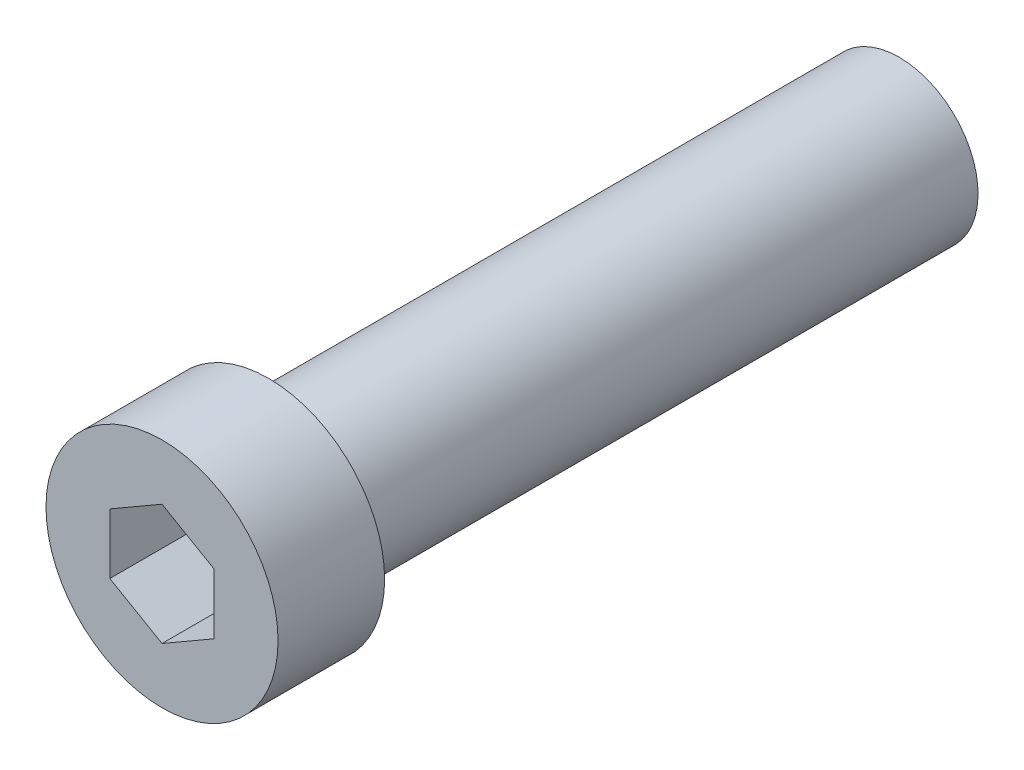
ISO-10303-21;
HEADER;
FILE_DESCRIPTION(('STEP AP214'),'2;1');
FILE_NAME('part.step','',(''),(''),'','','');
FILE_SCHEMA(('AUTOMOTIVE_DESIGN { 1 0 10303 214 1 1 1 1 }'));
ENDSEC;
DATA;
#1=APPLICATION_CONTEXT('core data for automotive mechanical design processes');
#2=APPLICATION_PROTOCOL_DEFINITION('international standard','automotive_design',2000,#1);
#3=PRODUCT_CONTEXT('',#1,'mechanical');
#4=PRODUCT('Part','Part','',(#3));
#5=PRODUCT_RELATED_PRODUCT_CATEGORY('part','',(#4));
#6=PRODUCT_DEFINITION_FORMATION('','',#4);
#7=PRODUCT_DEFINITION_CONTEXT('part definition',#1,'design');
#8=PRODUCT_DEFINITION('design','',#6,#7);
#9=PRODUCT_DEFINITION_SHAPE('','',#8);
#10=(LENGTH_UNIT() NAMED_UNIT(*) SI_UNIT(.MILLI.,.METRE.));
#11=(NAMED_UNIT(*) PLANE_ANGLE_UNIT() SI_UNIT($,.RADIAN.));
#12=(NAMED_UNIT(*) SI_UNIT($,.STERADIAN.) SOLID_ANGLE_UNIT());
#13=UNCERTAINTY_MEASURE_WITH_UNIT(LENGTH_MEASURE(1.E-05),#10,'distance_accuracy_value','');
#14=(GEOMETRIC_REPRESENTATION_CONTEXT(3) GLOBAL_UNCERTAINTY_ASSIGNED_CONTEXT((#13)) GLOBAL_UNIT_ASSIGNED_CONTEXT((#10,
#11,#12)) REPRESENTATION_CONTEXT('',''));
#15=CARTESIAN_POINT('',(0.,0.,0.));
#16=DIRECTION('',(0.,0.,1.));
#17=DIRECTION('',(1.,0.,0.));
#18=AXIS2_PLACEMENT_3D('',#15,#16,#17);
#19=CARTESIAN_POINT('',(0.,0.,2.028));
#20=DIRECTION('',(0.,0.,-1.));
#21=DIRECTION('',(0.,1.,0.));
#22=AXIS2_PLACEMENT_3D('',#19,#20,#21);
#23=CYLINDRICAL_SURFACE('',#22,2.208);
#24=CARTESIAN_POINT('',(0.,0.,2.028));
#25=DIRECTION('',(0.,0.,-1.));
#26=DIRECTION('',(0.,1.,0.));
#27=AXIS2_PLACEMENT_3D('',#24,#25,#26);
#28=CIRCLE('',#27,2.208);
#29=CARTESIAN_POINT('',(0.,2.208,2.028));
#30=VERTEX_POINT('',#29);
#31=EDGE_CURVE('E40',#30,#30,#28,.T.);
#32=ORIENTED_EDGE('',*,*,#31,.T.);
#33=EDGE_LOOP('',(#32));
#34=FACE_BOUND('',#33,.T.);
#35=CARTESIAN_POINT('',(0.,0.,0.));
#36=DIRECTION('',(0.,0.,-1.));
#37=DIRECTION('',(0.,1.,0.));
#38=AXIS2_PLACEMENT_3D('',#35,#36,#37);
#39=CIRCLE('',#38,2.208);
#40=CARTESIAN_POINT('',(0.,2.208,0.));
#41=VERTEX_POINT('',#40);
#42=EDGE_CURVE('E146',#41,#41,#39,.T.);
#43=ORIENTED_EDGE('',*,*,#42,.F.);
#44=EDGE_LOOP('',(#43));
#45=FACE_BOUND('',#44,.T.);
#46=ADVANCED_FACE('F37',(#34,#45),#23,.T.);
#47=CARTESIAN_POINT('',(2.208,0.,2.028));
#48=DIRECTION('',(0.,0.,1.));
#49=DIRECTION('',(0.,-1.,0.));
#50=AXIS2_PLACEMENT_3D('',#47,#48,#49);
#51=PLANE('',#50);
#52=DIRECTION('',(0.866025403784439,0.5,0.));
#53=VECTOR('',#52,1.);
#54=CARTESIAN_POINT('',(0.,-1.14731045493362,2.028));
#55=LINE('',#54,#53);
#56=CARTESIAN_POINT('',(0.,-1.14731045493362,2.028));
#57=VERTEX_POINT('',#56);
#58=CARTESIAN_POINT('',(0.9936,-0.573655227466812,2.028));
#59=VERTEX_POINT('',#58);
#60=EDGE_CURVE('E52',#57,#59,#55,.T.);
#61=ORIENTED_EDGE('',*,*,#60,.F.);
#62=DIRECTION('',(0.866025403784439,-0.5,0.));
#63=VECTOR('',#62,1.);
#64=CARTESIAN_POINT('',(-0.9936,-0.573655227466812,2.028));
#65=LINE('',#64,#63);
#66=CARTESIAN_POINT('',(-0.9936,-0.573655227466812,2.028));
#67=VERTEX_POINT('',#66);
#68=EDGE_CURVE('E135',#67,#57,#65,.T.);
#69=ORIENTED_EDGE('',*,*,#68,.F.);
#70=DIRECTION('',(0.,-1.,0.));
#71=VECTOR('',#70,1.);
#72=CARTESIAN_POINT('',(-0.9936,0.573655227466811,2.028));
#73=LINE('',#72,#71);
#74=CARTESIAN_POINT('',(-0.9936,0.573655227466811,2.028));
#75=VERTEX_POINT('',#74);
#76=EDGE_CURVE('E133',#75,#67,#73,.T.);
#77=ORIENTED_EDGE('',*,*,#76,.F.);
#78=DIRECTION('',(-0.866025403784438,-0.500000000000001,0.));
#79=VECTOR('',#78,1.);
#80=CARTESIAN_POINT('',(0.,1.14731045493362,2.028));
#81=LINE('',#80,#79);
#82=CARTESIAN_POINT('',(0.,1.14731045493362,2.028));
#83=VERTEX_POINT('',#82);
#84=EDGE_CURVE('E100',#83,#75,#81,.T.);
#85=ORIENTED_EDGE('',*,*,#84,.F.);
#86=DIRECTION('',(-0.866025403784438,0.500000000000001,0.));
#87=VECTOR('',#86,1.);
#88=CARTESIAN_POINT('',(0.9936,0.573655227466811,2.028));
#89=LINE('',#88,#87);
#90=CARTESIAN_POINT('',(0.9936,0.573655227466811,2.028));
#91=VERTEX_POINT('',#90);
#92=EDGE_CURVE('E129',#91,#83,#89,.T.);
#93=ORIENTED_EDGE('',*,*,#92,.F.);
#94=DIRECTION('',(0.,1.,0.));
#95=VECTOR('',#94,1.);
#96=CARTESIAN_POINT('',(0.9936,-0.573655227466812,2.028));
#97=LINE('',#96,#95);
#98=EDGE_CURVE('E126',#59,#91,#97,.T.);
#99=ORIENTED_EDGE('',*,*,#98,.F.);
#100=EDGE_LOOP('',(#61,#69,#77,#85,#93,#99));
#101=FACE_BOUND('',#100,.T.);
#102=ORIENTED_EDGE('',*,*,#31,.F.);
#103=EDGE_LOOP('',(#102));
#104=FACE_BOUND('',#103,.T.);
#105=ADVANCED_FACE('F155',(#101,#104),#51,.T.);
#106=CARTESIAN_POINT('',(0.,0.,0.));
#107=DIRECTION('',(0.,0.,-1.));
#108=DIRECTION('',(0.,1.,0.));
#109=AXIS2_PLACEMENT_3D('',#106,#107,#108);
#110=PLANE('',#109);
#111=CARTESIAN_POINT('',(0.,0.,0.));
#112=DIRECTION('',(0.,0.,-1.));
#113=DIRECTION('',(0.,1.,0.));
#114=AXIS2_PLACEMENT_3D('',#111,#112,#113);
#115=CIRCLE('',#114,1.50000000000006);
#116=CARTESIAN_POINT('',(0.,1.50000000000006,0.));
#117=VERTEX_POINT('',#116);
#118=EDGE_CURVE('E11',#117,#117,#115,.T.);
#119=ORIENTED_EDGE('',*,*,#118,.F.);
#120=EDGE_LOOP('',(#119));
#121=FACE_BOUND('',#120,.T.);
#122=ORIENTED_EDGE('',*,*,#42,.T.);
#123=EDGE_LOOP('',(#122));
#124=FACE_BOUND('',#123,.T.);
#125=ADVANCED_FACE('F157',(#121,#124),#110,.T.);
#126=CARTESIAN_POINT('',(0.,0.,-12.));
#127=DIRECTION('',(0.,0.,1.));
#128=DIRECTION('',(0.,-1.,0.));
#129=AXIS2_PLACEMENT_3D('',#126,#127,#128);
#130=CYLINDRICAL_SURFACE('',#129,1.50000000000006);
#131=CARTESIAN_POINT('',(0.,0.,-12.));
#132=DIRECTION('',(0.,0.,-1.));
#133=DIRECTION('',(0.,1.,0.));
#134=AXIS2_PLACEMENT_3D('',#131,#132,#133);
#135=CIRCLE('',#134,1.50000000000006);
#136=CARTESIAN_POINT('',(0.,1.50000000000005,-12.));
#137=VERTEX_POINT('',#136);
#138=EDGE_CURVE('E139',#137,#137,#135,.T.);
#139=ORIENTED_EDGE('',*,*,#138,.F.);
#140=EDGE_LOOP('',(#139));
#141=FACE_BOUND('',#140,.T.);
#142=ORIENTED_EDGE('',*,*,#118,.T.);
#143=EDGE_LOOP('',(#142));
#144=FACE_BOUND('',#143,.T.);
#145=ADVANCED_FACE('F163',(#141,#144),#130,.T.);
#146=CARTESIAN_POINT('',(0.,0.,-12.));
#147=DIRECTION('',(0.,0.,-1.));
#148=DIRECTION('',(0.,1.,0.));
#149=AXIS2_PLACEMENT_3D('',#146,#147,#148);
#150=PLANE('',#149);
#151=ORIENTED_EDGE('',*,*,#138,.T.);
#152=EDGE_LOOP('',(#151));
#153=FACE_BOUND('',#152,.T.);
#154=ADVANCED_FACE('F169',(#153),#150,.T.);
#155=CARTESIAN_POINT('',(0.,-1.14731045493362,0.156));
#156=DIRECTION('',(0.5,-0.866025403784439,0.));
#157=DIRECTION('',(0.866025403784439,0.5,0.));
#158=AXIS2_PLACEMENT_3D('',#155,#156,#157);
#159=PLANE('',#158);
#160=ORIENTED_EDGE('',*,*,#60,.T.);
#161=DIRECTION('',(0.,0.,1.));
#162=VECTOR('',#161,1.);
#163=CARTESIAN_POINT('',(0.9936,-0.573655227466812,0.156));
#164=LINE('',#163,#162);
#165=CARTESIAN_POINT('',(0.9936,-0.573655227466812,0.156));
#166=VERTEX_POINT('',#165);
#167=EDGE_CURVE('E82',#166,#59,#164,.T.);
#168=ORIENTED_EDGE('',*,*,#167,.F.);
#169=DIRECTION('',(0.866025403784439,0.5,0.));
#170=VECTOR('',#169,1.);
#171=CARTESIAN_POINT('',(0.,-1.14731045493362,0.156));
#172=LINE('',#171,#170);
#173=CARTESIAN_POINT('',(0.,-1.14731045493362,0.156));
#174=VERTEX_POINT('',#173);
#175=EDGE_CURVE('E137',#174,#166,#172,.T.);
#176=ORIENTED_EDGE('',*,*,#175,.F.);
#177=DIRECTION('',(0.,0.,1.));
#178=VECTOR('',#177,1.);
#179=CARTESIAN_POINT('',(0.,-1.14731045493362,0.156));
#180=LINE('',#179,#178);
#181=EDGE_CURVE('E60',#174,#57,#180,.T.);
#182=ORIENTED_EDGE('',*,*,#181,.T.);
#183=EDGE_LOOP('',(#160,#168,#176,#182));
#184=FACE_BOUND('',#183,.T.);
#185=ADVANCED_FACE('F173',(#184),#159,.F.);
#186=CARTESIAN_POINT('',(-0.9936,-0.573655227466812,0.156));
#187=DIRECTION('',(-0.5,-0.866025403784439,0.));
#188=DIRECTION('',(0.866025403784439,-0.5,0.));
#189=AXIS2_PLACEMENT_3D('',#186,#187,#188);
#190=PLANE('',#189);
#191=ORIENTED_EDGE('',*,*,#68,.T.);
#192=ORIENTED_EDGE('',*,*,#181,.F.);
#193=DIRECTION('',(0.866025403784439,-0.5,0.));
#194=VECTOR('',#193,1.);
#195=CARTESIAN_POINT('',(-0.9936,-0.573655227466812,0.156));
#196=LINE('',#195,#194);
#197=CARTESIAN_POINT('',(-0.9936,-0.573655227466812,0.156));
#198=VERTEX_POINT('',#197);
#199=EDGE_CURVE('E112',#198,#174,#196,.T.);
#200=ORIENTED_EDGE('',*,*,#199,.F.);
#201=DIRECTION('',(0.,0.,1.));
#202=VECTOR('',#201,1.);
#203=CARTESIAN_POINT('',(-0.9936,-0.573655227466812,0.156));
#204=LINE('',#203,#202);
#205=EDGE_CURVE('E104',#198,#67,#204,.T.);
#206=ORIENTED_EDGE('',*,*,#205,.T.);
#207=EDGE_LOOP('',(#191,#192,#200,#206));
#208=FACE_BOUND('',#207,.T.);
#209=ADVANCED_FACE('F177',(#208),#190,.F.);
#210=CARTESIAN_POINT('',(-0.9936,0.573655227466811,0.156));
#211=DIRECTION('',(-1.,0.,0.));
#212=DIRECTION('',(0.,0.,1.));
#213=AXIS2_PLACEMENT_3D('',#210,#211,#212);
#214=PLANE('',#213);
#215=ORIENTED_EDGE('',*,*,#76,.T.);
#216=ORIENTED_EDGE('',*,*,#205,.F.);
#217=DIRECTION('',(0.,-1.,0.));
#218=VECTOR('',#217,1.);
#219=CARTESIAN_POINT('',(-0.9936,0.573655227466811,0.156));
#220=LINE('',#219,#218);
#221=CARTESIAN_POINT('',(-0.9936,0.573655227466811,0.156));
#222=VERTEX_POINT('',#221);
#223=EDGE_CURVE('E108',#222,#198,#220,.T.);
#224=ORIENTED_EDGE('',*,*,#223,.F.);
#225=DIRECTION('',(0.,0.,1.));
#226=VECTOR('',#225,1.);
#227=CARTESIAN_POINT('',(-0.9936,0.573655227466811,0.156));
#228=LINE('',#227,#226);
#229=EDGE_CURVE('E93',#222,#75,#228,.T.);
#230=ORIENTED_EDGE('',*,*,#229,.T.);
#231=EDGE_LOOP('',(#215,#216,#224,#230));
#232=FACE_BOUND('',#231,.T.);
#233=ADVANCED_FACE('F109',(#232),#214,.F.);
#234=CARTESIAN_POINT('',(0.,1.14731045493362,0.156));
#235=DIRECTION('',(-0.500000000000001,0.866025403784438,0.));
#236=DIRECTION('',(-0.866025403784438,-0.500000000000001,0.));
#237=AXIS2_PLACEMENT_3D('',#234,#235,#236);
#238=PLANE('',#237);
#239=ORIENTED_EDGE('',*,*,#84,.T.);
#240=ORIENTED_EDGE('',*,*,#229,.F.);
#241=DIRECTION('',(-0.866025403784438,-0.500000000000001,0.));
#242=VECTOR('',#241,1.);
#243=CARTESIAN_POINT('',(0.,1.14731045493362,0.156));
#244=LINE('',#243,#242);
#245=CARTESIAN_POINT('',(0.,1.14731045493362,0.156));
#246=VERTEX_POINT('',#245);
#247=EDGE_CURVE('E97',#246,#222,#244,.T.);
#248=ORIENTED_EDGE('',*,*,#247,.F.);
#249=DIRECTION('',(0.,0.,1.));
#250=VECTOR('',#249,1.);
#251=CARTESIAN_POINT('',(0.,1.14731045493362,0.156));
#252=LINE('',#251,#250);
#253=EDGE_CURVE('E105',#246,#83,#252,.T.);
#254=ORIENTED_EDGE('',*,*,#253,.T.);
#255=EDGE_LOOP('',(#239,#240,#248,#254));
#256=FACE_BOUND('',#255,.T.);
#257=ADVANCED_FACE('F95',(#256),#238,.F.);
#258=CARTESIAN_POINT('',(0.9936,0.573655227466811,0.156));
#259=DIRECTION('',(0.500000000000001,0.866025403784438,0.));
#260=DIRECTION('',(-0.866025403784438,0.500000000000001,0.));
#261=AXIS2_PLACEMENT_3D('',#258,#259,#260);
#262=PLANE('',#261);
#263=ORIENTED_EDGE('',*,*,#92,.T.);
#264=ORIENTED_EDGE('',*,*,#253,.F.);
#265=DIRECTION('',(-0.866025403784438,0.500000000000001,0.));
#266=VECTOR('',#265,1.);
#267=CARTESIAN_POINT('',(0.9936,0.573655227466811,0.156));
#268=LINE('',#267,#266);
#269=CARTESIAN_POINT('',(0.9936,0.573655227466811,0.156));
#270=VERTEX_POINT('',#269);
#271=EDGE_CURVE('E118',#270,#246,#268,.T.);
#272=ORIENTED_EDGE('',*,*,#271,.F.);
#273=DIRECTION('',(0.,0.,1.));
#274=VECTOR('',#273,1.);
#275=CARTESIAN_POINT('',(0.9936,0.573655227466811,0.156));
#276=LINE('',#275,#274);
#277=EDGE_CURVE('E142',#270,#91,#276,.T.);
#278=ORIENTED_EDGE('',*,*,#277,.T.);
#279=EDGE_LOOP('',(#263,#264,#272,#278));
#280=FACE_BOUND('',#279,.T.);
#281=ADVANCED_FACE('F181',(#280),#262,.F.);
#282=CARTESIAN_POINT('',(0.9936,-0.573655227466812,0.156));
#283=DIRECTION('',(1.,0.,0.));
#284=DIRECTION('',(0.,0.,-1.));
#285=AXIS2_PLACEMENT_3D('',#282,#283,#284);
#286=PLANE('',#285);
#287=ORIENTED_EDGE('',*,*,#98,.T.);
#288=ORIENTED_EDGE('',*,*,#277,.F.);
#289=DIRECTION('',(0.,1.,0.));
#290=VECTOR('',#289,1.);
#291=CARTESIAN_POINT('',(0.9936,-0.573655227466812,0.156));
#292=LINE('',#291,#290);
#293=EDGE_CURVE('E120',#166,#270,#292,.T.);
#294=ORIENTED_EDGE('',*,*,#293,.F.);
#295=ORIENTED_EDGE('',*,*,#167,.T.);
#296=EDGE_LOOP('',(#287,#288,#294,#295));
#297=FACE_BOUND('',#296,.T.);
#298=ADVANCED_FACE('F178',(#297),#286,.F.);
#299=CARTESIAN_POINT('',(0.,0.,0.156));
#300=DIRECTION('',(0.,0.,1.));
#301=DIRECTION('',(1.,0.,0.));
#302=AXIS2_PLACEMENT_3D('',#299,#300,#301);
#303=PLANE('',#302);
#304=ORIENTED_EDGE('',*,*,#175,.T.);
#305=ORIENTED_EDGE('',*,*,#293,.T.);
#306=ORIENTED_EDGE('',*,*,#271,.T.);
#307=ORIENTED_EDGE('',*,*,#247,.T.);
#308=ORIENTED_EDGE('',*,*,#223,.T.);
#309=ORIENTED_EDGE('',*,*,#199,.T.);
#310=EDGE_LOOP('',(#304,#305,#306,#307,#308,#309));
#311=FACE_BOUND('',#310,.T.);
#312=ADVANCED_FACE('F115',(#311),#303,.T.);
#313=CLOSED_SHELL('',(#46,#105,#125,#145,#154,#185,#209,#233,#257,#281,#298,#312));
#314=MANIFOLD_SOLID_BREP('B2',#313);
#315=ADVANCED_BREP_SHAPE_REPRESENTATION('',(#18,#314),#14);
#316=SHAPE_DEFINITION_REPRESENTATION(#9,#315);
ENDSEC;
END-ISO-10303-21;
